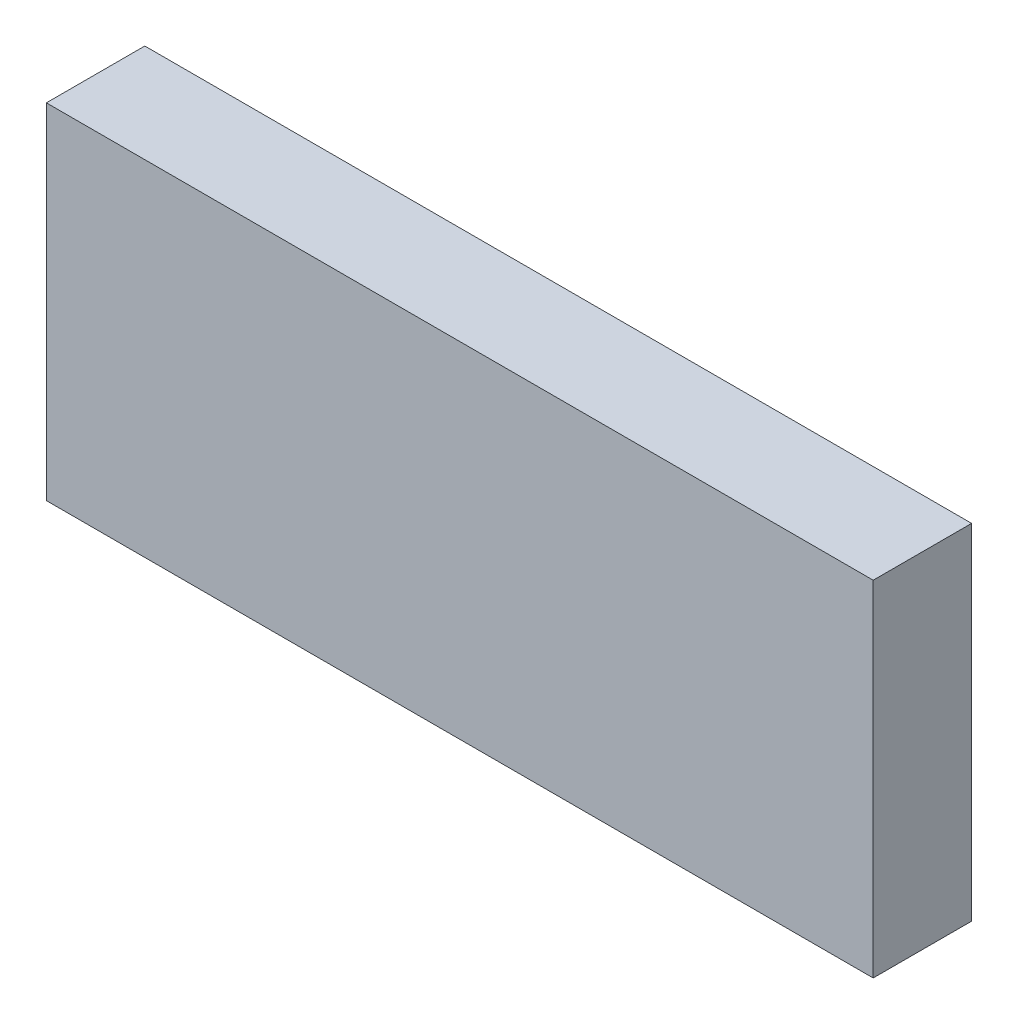
ISO-10303-21;
HEADER;
FILE_DESCRIPTION(('STEP AP214'),'2;1');
FILE_NAME('part.step','',(''),(''),'','','');
FILE_SCHEMA(('AUTOMOTIVE_DESIGN { 1 0 10303 214 1 1 1 1 }'));
ENDSEC;
DATA;
#1=APPLICATION_CONTEXT('core data for automotive mechanical design processes');
#2=APPLICATION_PROTOCOL_DEFINITION('international standard','automotive_design',2000,#1);
#3=PRODUCT_CONTEXT('',#1,'mechanical');
#4=PRODUCT('Part','Part','',(#3));
#5=PRODUCT_RELATED_PRODUCT_CATEGORY('part','',(#4));
#6=PRODUCT_DEFINITION_FORMATION('','',#4);
#7=PRODUCT_DEFINITION_CONTEXT('part definition',#1,'design');
#8=PRODUCT_DEFINITION('design','',#6,#7);
#9=PRODUCT_DEFINITION_SHAPE('','',#8);
#10=(LENGTH_UNIT() NAMED_UNIT(*) SI_UNIT(.MILLI.,.METRE.));
#11=(NAMED_UNIT(*) PLANE_ANGLE_UNIT() SI_UNIT($,.RADIAN.));
#12=(NAMED_UNIT(*) SI_UNIT($,.STERADIAN.) SOLID_ANGLE_UNIT());
#13=UNCERTAINTY_MEASURE_WITH_UNIT(LENGTH_MEASURE(1.E-05),#10,'distance_accuracy_value','');
#14=(GEOMETRIC_REPRESENTATION_CONTEXT(3) GLOBAL_UNCERTAINTY_ASSIGNED_CONTEXT((#13)) GLOBAL_UNIT_ASSIGNED_CONTEXT((#10,
#11,#12)) REPRESENTATION_CONTEXT('',''));
#15=CARTESIAN_POINT('',(0.,0.,0.));
#16=DIRECTION('',(0.,0.,1.));
#17=DIRECTION('',(1.,0.,0.));
#18=AXIS2_PLACEMENT_3D('',#15,#16,#17);
#19=CARTESIAN_POINT('',(53.34,-22.225,12.7));
#20=DIRECTION('',(-1.,0.,0.));
#21=DIRECTION('',(0.,0.,1.));
#22=AXIS2_PLACEMENT_3D('',#19,#20,#21);
#23=PLANE('',#22);
#24=DIRECTION('',(0.,1.,0.));
#25=VECTOR('',#24,1.);
#26=CARTESIAN_POINT('',(53.34,-22.225,0.));
#27=LINE('',#26,#25);
#28=CARTESIAN_POINT('',(53.34,-22.225,0.));
#29=VERTEX_POINT('',#28);
#30=CARTESIAN_POINT('',(53.34,22.225,0.));
#31=VERTEX_POINT('',#30);
#32=EDGE_CURVE('E96',#29,#31,#27,.T.);
#33=ORIENTED_EDGE('',*,*,#32,.T.);
#34=DIRECTION('',(0.,0.,-1.));
#35=VECTOR('',#34,1.);
#36=CARTESIAN_POINT('',(53.34,22.225,12.7));
#37=LINE('',#36,#35);
#38=CARTESIAN_POINT('',(53.34,22.225,12.7));
#39=VERTEX_POINT('',#38);
#40=EDGE_CURVE('E11',#39,#31,#37,.T.);
#41=ORIENTED_EDGE('',*,*,#40,.F.);
#42=DIRECTION('',(0.,1.,0.));
#43=VECTOR('',#42,1.);
#44=CARTESIAN_POINT('',(53.34,-22.225,12.7));
#45=LINE('',#44,#43);
#46=CARTESIAN_POINT('',(53.34,-22.225,12.7));
#47=VERTEX_POINT('',#46);
#48=EDGE_CURVE('E84',#47,#39,#45,.T.);
#49=ORIENTED_EDGE('',*,*,#48,.F.);
#50=DIRECTION('',(0.,0.,-1.));
#51=VECTOR('',#50,1.);
#52=CARTESIAN_POINT('',(53.34,-22.225,12.7));
#53=LINE('',#52,#51);
#54=EDGE_CURVE('E92',#47,#29,#53,.T.);
#55=ORIENTED_EDGE('',*,*,#54,.T.);
#56=EDGE_LOOP('',(#33,#41,#49,#55));
#57=FACE_BOUND('',#56,.T.);
#58=ADVANCED_FACE('F33',(#57),#23,.F.);
#59=CARTESIAN_POINT('',(-53.34,22.225,12.7));
#60=DIRECTION('',(0.,-1.,0.));
#61=DIRECTION('',(0.,0.,-1.));
#62=AXIS2_PLACEMENT_3D('',#59,#60,#61);
#63=PLANE('',#62);
#64=DIRECTION('',(-1.,0.,0.));
#65=VECTOR('',#64,1.);
#66=CARTESIAN_POINT('',(-53.34,22.225,0.));
#67=LINE('',#66,#65);
#68=CARTESIAN_POINT('',(-53.34,22.225,0.));
#69=VERTEX_POINT('',#68);
#70=EDGE_CURVE('E88',#31,#69,#67,.T.);
#71=ORIENTED_EDGE('',*,*,#70,.T.);
#72=DIRECTION('',(0.,0.,-1.));
#73=VECTOR('',#72,1.);
#74=CARTESIAN_POINT('',(-53.34,22.225,12.7));
#75=LINE('',#74,#73);
#76=CARTESIAN_POINT('',(-53.34,22.225,12.7));
#77=VERTEX_POINT('',#76);
#78=EDGE_CURVE('E41',#77,#69,#75,.T.);
#79=ORIENTED_EDGE('',*,*,#78,.F.);
#80=DIRECTION('',(-1.,0.,0.));
#81=VECTOR('',#80,1.);
#82=CARTESIAN_POINT('',(-53.34,22.225,12.7));
#83=LINE('',#82,#81);
#84=EDGE_CURVE('E79',#39,#77,#83,.T.);
#85=ORIENTED_EDGE('',*,*,#84,.F.);
#86=ORIENTED_EDGE('',*,*,#40,.T.);
#87=EDGE_LOOP('',(#71,#79,#85,#86));
#88=FACE_BOUND('',#87,.T.);
#89=ADVANCED_FACE('F87',(#88),#63,.F.);
#90=CARTESIAN_POINT('',(-53.34,-22.225,12.7));
#91=DIRECTION('',(1.,0.,0.));
#92=DIRECTION('',(0.,0.,-1.));
#93=AXIS2_PLACEMENT_3D('',#90,#91,#92);
#94=PLANE('',#93);
#95=DIRECTION('',(0.,-1.,0.));
#96=VECTOR('',#95,1.);
#97=CARTESIAN_POINT('',(-53.34,-22.225,0.));
#98=LINE('',#97,#96);
#99=CARTESIAN_POINT('',(-53.34,-22.225,0.));
#100=VERTEX_POINT('',#99);
#101=EDGE_CURVE('E66',#69,#100,#98,.T.);
#102=ORIENTED_EDGE('',*,*,#101,.T.);
#103=DIRECTION('',(0.,0.,-1.));
#104=VECTOR('',#103,1.);
#105=CARTESIAN_POINT('',(-53.34,-22.225,12.7));
#106=LINE('',#105,#104);
#107=CARTESIAN_POINT('',(-53.34,-22.225,12.7));
#108=VERTEX_POINT('',#107);
#109=EDGE_CURVE('E89',#108,#100,#106,.T.);
#110=ORIENTED_EDGE('',*,*,#109,.F.);
#111=DIRECTION('',(0.,-1.,0.));
#112=VECTOR('',#111,1.);
#113=CARTESIAN_POINT('',(-53.34,-22.225,12.7));
#114=LINE('',#113,#112);
#115=EDGE_CURVE('E82',#77,#108,#114,.T.);
#116=ORIENTED_EDGE('',*,*,#115,.F.);
#117=ORIENTED_EDGE('',*,*,#78,.T.);
#118=EDGE_LOOP('',(#102,#110,#116,#117));
#119=FACE_BOUND('',#118,.T.);
#120=ADVANCED_FACE('F90',(#119),#94,.F.);
#121=CARTESIAN_POINT('',(-53.34,-22.225,12.7));
#122=DIRECTION('',(0.,1.,0.));
#123=DIRECTION('',(0.,0.,1.));
#124=AXIS2_PLACEMENT_3D('',#121,#122,#123);
#125=PLANE('',#124);
#126=DIRECTION('',(1.,0.,0.));
#127=VECTOR('',#126,1.);
#128=CARTESIAN_POINT('',(-53.34,-22.225,0.));
#129=LINE('',#128,#127);
#130=EDGE_CURVE('E72',#100,#29,#129,.T.);
#131=ORIENTED_EDGE('',*,*,#130,.T.);
#132=ORIENTED_EDGE('',*,*,#54,.F.);
#133=DIRECTION('',(1.,0.,0.));
#134=VECTOR('',#133,1.);
#135=CARTESIAN_POINT('',(-53.34,-22.225,12.7));
#136=LINE('',#135,#134);
#137=EDGE_CURVE('E49',#108,#47,#136,.T.);
#138=ORIENTED_EDGE('',*,*,#137,.F.);
#139=ORIENTED_EDGE('',*,*,#109,.T.);
#140=EDGE_LOOP('',(#131,#132,#138,#139));
#141=FACE_BOUND('',#140,.T.);
#142=ADVANCED_FACE('F103',(#141),#125,.F.);
#143=CARTESIAN_POINT('',(0.,0.,12.7));
#144=DIRECTION('',(0.,0.,-1.));
#145=DIRECTION('',(-1.,0.,0.));
#146=AXIS2_PLACEMENT_3D('',#143,#144,#145);
#147=PLANE('',#146);
#148=ORIENTED_EDGE('',*,*,#48,.T.);
#149=ORIENTED_EDGE('',*,*,#84,.T.);
#150=ORIENTED_EDGE('',*,*,#115,.T.);
#151=ORIENTED_EDGE('',*,*,#137,.T.);
#152=EDGE_LOOP('',(#148,#149,#150,#151));
#153=FACE_BOUND('',#152,.T.);
#154=ADVANCED_FACE('F80',(#153),#147,.F.);
#155=CARTESIAN_POINT('',(0.,0.,0.));
#156=DIRECTION('',(0.,0.,-1.));
#157=DIRECTION('',(-1.,0.,0.));
#158=AXIS2_PLACEMENT_3D('',#155,#156,#157);
#159=PLANE('',#158);
#160=ORIENTED_EDGE('',*,*,#32,.F.);
#161=ORIENTED_EDGE('',*,*,#130,.F.);
#162=ORIENTED_EDGE('',*,*,#101,.F.);
#163=ORIENTED_EDGE('',*,*,#70,.F.);
#164=EDGE_LOOP('',(#160,#161,#162,#163));
#165=FACE_BOUND('',#164,.T.);
#166=ADVANCED_FACE('F106',(#165),#159,.T.);
#167=CLOSED_SHELL('',(#58,#89,#120,#142,#154,#166));
#168=MANIFOLD_SOLID_BREP('B2',#167);
#169=ADVANCED_BREP_SHAPE_REPRESENTATION('',(#18,#168),#14);
#170=SHAPE_DEFINITION_REPRESENTATION(#9,#169);
ENDSEC;
END-ISO-10303-21;
